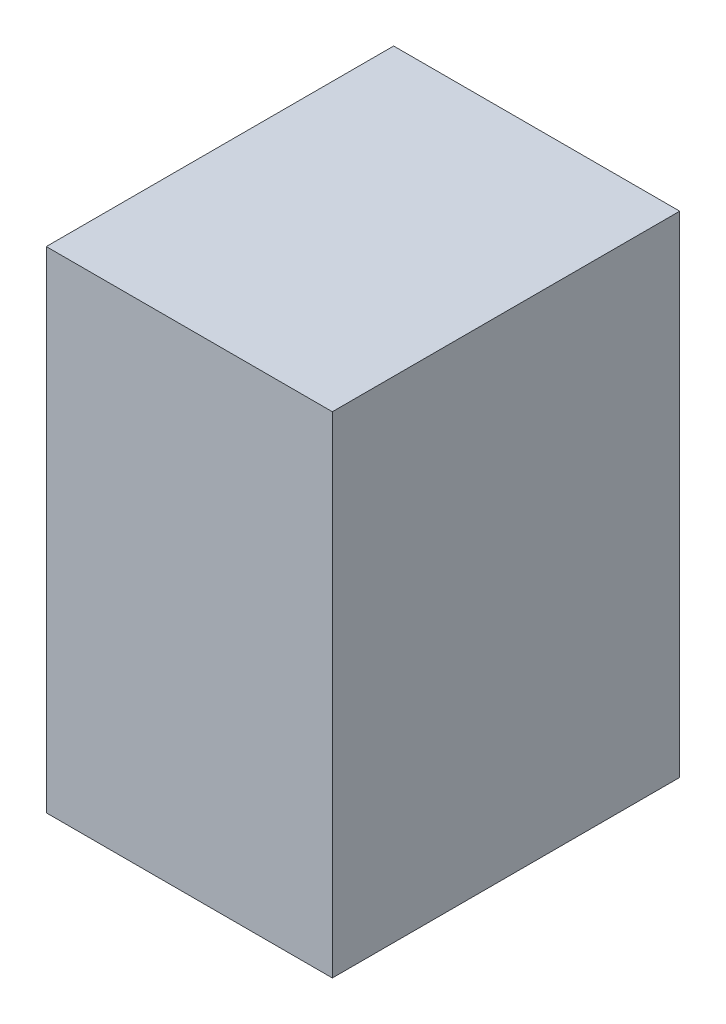
ISO-10303-21;
HEADER;
FILE_DESCRIPTION(('STEP AP214'),'2;1');
FILE_NAME('part.step','',(''),(''),'','','');
FILE_SCHEMA(('AUTOMOTIVE_DESIGN { 1 0 10303 214 1 1 1 1 }'));
ENDSEC;
DATA;
#1=APPLICATION_CONTEXT('core data for automotive mechanical design processes');
#2=APPLICATION_PROTOCOL_DEFINITION('international standard','automotive_design',2000,#1);
#3=PRODUCT_CONTEXT('',#1,'mechanical');
#4=PRODUCT('Part','Part','',(#3));
#5=PRODUCT_RELATED_PRODUCT_CATEGORY('part','',(#4));
#6=PRODUCT_DEFINITION_FORMATION('','',#4);
#7=PRODUCT_DEFINITION_CONTEXT('part definition',#1,'design');
#8=PRODUCT_DEFINITION('design','',#6,#7);
#9=PRODUCT_DEFINITION_SHAPE('','',#8);
#10=(LENGTH_UNIT() NAMED_UNIT(*) SI_UNIT(.MILLI.,.METRE.));
#11=(NAMED_UNIT(*) PLANE_ANGLE_UNIT() SI_UNIT($,.RADIAN.));
#12=(NAMED_UNIT(*) SI_UNIT($,.STERADIAN.) SOLID_ANGLE_UNIT());
#13=UNCERTAINTY_MEASURE_WITH_UNIT(LENGTH_MEASURE(1.E-05),#10,'distance_accuracy_value','');
#14=(GEOMETRIC_REPRESENTATION_CONTEXT(3) GLOBAL_UNCERTAINTY_ASSIGNED_CONTEXT((#13)) GLOBAL_UNIT_ASSIGNED_CONTEXT((#10,
#11,#12)) REPRESENTATION_CONTEXT('',''));
#15=CARTESIAN_POINT('',(0.,0.,0.));
#16=DIRECTION('',(0.,0.,1.));
#17=DIRECTION('',(1.,0.,0.));
#18=AXIS2_PLACEMENT_3D('',#15,#16,#17);
#19=CARTESIAN_POINT('',(0.,0.,0.));
#20=DIRECTION('',(0.,-1.,0.));
#21=DIRECTION('',(0.,0.,-1.));
#22=AXIS2_PLACEMENT_3D('',#19,#20,#21);
#23=PLANE('',#22);
#24=DIRECTION('',(0.,0.,-1.));
#25=VECTOR('',#24,1.);
#26=CARTESIAN_POINT('',(35.,0.,42.5));
#27=LINE('',#26,#25);
#28=CARTESIAN_POINT('',(35.,0.,42.5));
#29=VERTEX_POINT('',#28);
#30=CARTESIAN_POINT('',(35.,0.,-42.5));
#31=VERTEX_POINT('',#30);
#32=EDGE_CURVE('E136',#29,#31,#27,.T.);
#33=ORIENTED_EDGE('',*,*,#32,.F.);
#34=DIRECTION('',(1.,0.,0.));
#35=VECTOR('',#34,1.);
#36=CARTESIAN_POINT('',(-35.,0.,42.5));
#37=LINE('',#36,#35);
#38=CARTESIAN_POINT('',(-35.,0.,42.5));
#39=VERTEX_POINT('',#38);
#40=EDGE_CURVE('E84',#39,#29,#37,.T.);
#41=ORIENTED_EDGE('',*,*,#40,.F.);
#42=DIRECTION('',(0.,0.,1.));
#43=VECTOR('',#42,1.);
#44=CARTESIAN_POINT('',(-35.,0.,42.5));
#45=LINE('',#44,#43);
#46=CARTESIAN_POINT('',(-35.,0.,-42.5));
#47=VERTEX_POINT('',#46);
#48=EDGE_CURVE('E164',#47,#39,#45,.T.);
#49=ORIENTED_EDGE('',*,*,#48,.F.);
#50=DIRECTION('',(-1.,0.,0.));
#51=VECTOR('',#50,1.);
#52=CARTESIAN_POINT('',(-35.,0.,-42.5));
#53=LINE('',#52,#51);
#54=EDGE_CURVE('E140',#31,#47,#53,.T.);
#55=ORIENTED_EDGE('',*,*,#54,.F.);
#56=EDGE_LOOP('',(#33,#41,#49,#55));
#57=FACE_BOUND('',#56,.T.);
#58=DIRECTION('',(1.,0.,0.));
#59=VECTOR('',#58,1.);
#60=CARTESIAN_POINT('',(0.,0.,30.5));
#61=LINE('',#60,#59);
#62=CARTESIAN_POINT('',(-23.,0.,30.5));
#63=VERTEX_POINT('',#62);
#64=CARTESIAN_POINT('',(23.,0.,30.5));
#65=VERTEX_POINT('',#64);
#66=EDGE_CURVE('E131',#63,#65,#61,.T.);
#67=ORIENTED_EDGE('',*,*,#66,.T.);
#68=DIRECTION('',(0.,0.,-1.));
#69=VECTOR('',#68,1.);
#70=CARTESIAN_POINT('',(23.,0.,0.));
#71=LINE('',#70,#69);
#72=CARTESIAN_POINT('',(23.,0.,-30.5));
#73=VERTEX_POINT('',#72);
#74=EDGE_CURVE('E150',#65,#73,#71,.T.);
#75=ORIENTED_EDGE('',*,*,#74,.T.);
#76=DIRECTION('',(-1.,0.,0.));
#77=VECTOR('',#76,1.);
#78=CARTESIAN_POINT('',(0.,0.,-30.5));
#79=LINE('',#78,#77);
#80=CARTESIAN_POINT('',(-23.,0.,-30.5));
#81=VERTEX_POINT('',#80);
#82=EDGE_CURVE('E135',#73,#81,#79,.T.);
#83=ORIENTED_EDGE('',*,*,#82,.T.);
#84=DIRECTION('',(0.,0.,1.));
#85=VECTOR('',#84,1.);
#86=CARTESIAN_POINT('',(-23.,0.,0.));
#87=LINE('',#86,#85);
#88=EDGE_CURVE('E54',#81,#63,#87,.T.);
#89=ORIENTED_EDGE('',*,*,#88,.T.);
#90=EDGE_LOOP('',(#67,#75,#83,#89));
#91=FACE_BOUND('',#90,.T.);
#92=ADVANCED_FACE('F39',(#57,#91),#23,.T.);
#93=CARTESIAN_POINT('',(35.,120.,42.5));
#94=DIRECTION('',(-1.,0.,0.));
#95=DIRECTION('',(0.,0.,1.));
#96=AXIS2_PLACEMENT_3D('',#93,#94,#95);
#97=PLANE('',#96);
#98=ORIENTED_EDGE('',*,*,#32,.T.);
#99=DIRECTION('',(0.,-1.,0.));
#100=VECTOR('',#99,1.);
#101=CARTESIAN_POINT('',(35.,120.,-42.5));
#102=LINE('',#101,#100);
#103=CARTESIAN_POINT('',(35.,120.,-42.5));
#104=VERTEX_POINT('',#103);
#105=EDGE_CURVE('E11',#104,#31,#102,.T.);
#106=ORIENTED_EDGE('',*,*,#105,.F.);
#107=DIRECTION('',(0.,0.,-1.));
#108=VECTOR('',#107,1.);
#109=CARTESIAN_POINT('',(35.,120.,42.5));
#110=LINE('',#109,#108);
#111=CARTESIAN_POINT('',(35.,120.,42.5));
#112=VERTEX_POINT('',#111);
#113=EDGE_CURVE('E156',#112,#104,#110,.T.);
#114=ORIENTED_EDGE('',*,*,#113,.F.);
#115=DIRECTION('',(0.,-1.,0.));
#116=VECTOR('',#115,1.);
#117=CARTESIAN_POINT('',(35.,120.,42.5));
#118=LINE('',#117,#116);
#119=EDGE_CURVE('E161',#112,#29,#118,.T.);
#120=ORIENTED_EDGE('',*,*,#119,.T.);
#121=EDGE_LOOP('',(#98,#106,#114,#120));
#122=FACE_BOUND('',#121,.T.);
#123=ADVANCED_FACE('F41',(#122),#97,.F.);
#124=CARTESIAN_POINT('',(-35.,120.,-42.5));
#125=DIRECTION('',(0.,0.,1.));
#126=DIRECTION('',(1.,0.,0.));
#127=AXIS2_PLACEMENT_3D('',#124,#125,#126);
#128=PLANE('',#127);
#129=ORIENTED_EDGE('',*,*,#54,.T.);
#130=DIRECTION('',(0.,-1.,0.));
#131=VECTOR('',#130,1.);
#132=CARTESIAN_POINT('',(-35.,120.,-42.5));
#133=LINE('',#132,#131);
#134=CARTESIAN_POINT('',(-35.,120.,-42.5));
#135=VERTEX_POINT('',#134);
#136=EDGE_CURVE('E47',#135,#47,#133,.T.);
#137=ORIENTED_EDGE('',*,*,#136,.F.);
#138=DIRECTION('',(-1.,0.,0.));
#139=VECTOR('',#138,1.);
#140=CARTESIAN_POINT('',(-35.,120.,-42.5));
#141=LINE('',#140,#139);
#142=EDGE_CURVE('E91',#104,#135,#141,.T.);
#143=ORIENTED_EDGE('',*,*,#142,.F.);
#144=ORIENTED_EDGE('',*,*,#105,.T.);
#145=EDGE_LOOP('',(#129,#137,#143,#144));
#146=FACE_BOUND('',#145,.T.);
#147=ADVANCED_FACE('F190',(#146),#128,.F.);
#148=CARTESIAN_POINT('',(-35.,120.,42.5));
#149=DIRECTION('',(1.,0.,0.));
#150=DIRECTION('',(0.,0.,-1.));
#151=AXIS2_PLACEMENT_3D('',#148,#149,#150);
#152=PLANE('',#151);
#153=ORIENTED_EDGE('',*,*,#48,.T.);
#154=DIRECTION('',(0.,-1.,0.));
#155=VECTOR('',#154,1.);
#156=CARTESIAN_POINT('',(-35.,120.,42.5));
#157=LINE('',#156,#155);
#158=CARTESIAN_POINT('',(-35.,120.,42.5));
#159=VERTEX_POINT('',#158);
#160=EDGE_CURVE('E168',#159,#39,#157,.T.);
#161=ORIENTED_EDGE('',*,*,#160,.F.);
#162=DIRECTION('',(0.,0.,1.));
#163=VECTOR('',#162,1.);
#164=CARTESIAN_POINT('',(-35.,120.,42.5));
#165=LINE('',#164,#163);
#166=EDGE_CURVE('E159',#135,#159,#165,.T.);
#167=ORIENTED_EDGE('',*,*,#166,.F.);
#168=ORIENTED_EDGE('',*,*,#136,.T.);
#169=EDGE_LOOP('',(#153,#161,#167,#168));
#170=FACE_BOUND('',#169,.T.);
#171=ADVANCED_FACE('F173',(#170),#152,.F.);
#172=CARTESIAN_POINT('',(-35.,120.,42.5));
#173=DIRECTION('',(0.,0.,-1.));
#174=DIRECTION('',(-1.,0.,0.));
#175=AXIS2_PLACEMENT_3D('',#172,#173,#174);
#176=PLANE('',#175);
#177=ORIENTED_EDGE('',*,*,#40,.T.);
#178=ORIENTED_EDGE('',*,*,#119,.F.);
#179=DIRECTION('',(1.,0.,0.));
#180=VECTOR('',#179,1.);
#181=CARTESIAN_POINT('',(-35.,120.,42.5));
#182=LINE('',#181,#180);
#183=EDGE_CURVE('E63',#159,#112,#182,.T.);
#184=ORIENTED_EDGE('',*,*,#183,.F.);
#185=ORIENTED_EDGE('',*,*,#160,.T.);
#186=EDGE_LOOP('',(#177,#178,#184,#185));
#187=FACE_BOUND('',#186,.T.);
#188=ADVANCED_FACE('F181',(#187),#176,.F.);
#189=CARTESIAN_POINT('',(0.,120.,0.));
#190=DIRECTION('',(0.,-1.,0.));
#191=DIRECTION('',(0.,0.,-1.));
#192=AXIS2_PLACEMENT_3D('',#189,#190,#191);
#193=PLANE('',#192);
#194=ORIENTED_EDGE('',*,*,#113,.T.);
#195=ORIENTED_EDGE('',*,*,#142,.T.);
#196=ORIENTED_EDGE('',*,*,#166,.T.);
#197=ORIENTED_EDGE('',*,*,#183,.T.);
#198=EDGE_LOOP('',(#194,#195,#196,#197));
#199=FACE_BOUND('',#198,.T.);
#200=ADVANCED_FACE('F183',(#199),#193,.F.);
#201=CARTESIAN_POINT('',(23.,120.,42.5));
#202=DIRECTION('',(-1.,0.,0.));
#203=DIRECTION('',(0.,0.,1.));
#204=AXIS2_PLACEMENT_3D('',#201,#202,#203);
#205=PLANE('',#204);
#206=ORIENTED_EDGE('',*,*,#74,.F.);
#207=DIRECTION('',(0.,-1.,0.));
#208=VECTOR('',#207,1.);
#209=CARTESIAN_POINT('',(23.,120.,30.5));
#210=LINE('',#209,#208);
#211=CARTESIAN_POINT('',(23.,108.,30.5));
#212=VERTEX_POINT('',#211);
#213=EDGE_CURVE('E130',#212,#65,#210,.T.);
#214=ORIENTED_EDGE('',*,*,#213,.F.);
#215=DIRECTION('',(0.,0.,-1.));
#216=VECTOR('',#215,1.);
#217=CARTESIAN_POINT('',(23.,108.,0.));
#218=LINE('',#217,#216);
#219=CARTESIAN_POINT('',(23.,108.,-30.5));
#220=VERTEX_POINT('',#219);
#221=EDGE_CURVE('E118',#212,#220,#218,.T.);
#222=ORIENTED_EDGE('',*,*,#221,.T.);
#223=DIRECTION('',(0.,-1.,0.));
#224=VECTOR('',#223,1.);
#225=CARTESIAN_POINT('',(23.,120.,-30.5));
#226=LINE('',#225,#224);
#227=EDGE_CURVE('E128',#220,#73,#226,.T.);
#228=ORIENTED_EDGE('',*,*,#227,.T.);
#229=EDGE_LOOP('',(#206,#214,#222,#228));
#230=FACE_BOUND('',#229,.T.);
#231=ADVANCED_FACE('F127',(#230),#205,.T.);
#232=CARTESIAN_POINT('',(-35.,120.,-30.5));
#233=DIRECTION('',(0.,0.,1.));
#234=DIRECTION('',(1.,0.,0.));
#235=AXIS2_PLACEMENT_3D('',#232,#233,#234);
#236=PLANE('',#235);
#237=ORIENTED_EDGE('',*,*,#82,.F.);
#238=ORIENTED_EDGE('',*,*,#227,.F.);
#239=DIRECTION('',(-1.,0.,0.));
#240=VECTOR('',#239,1.);
#241=CARTESIAN_POINT('',(0.,108.,-30.5));
#242=LINE('',#241,#240);
#243=CARTESIAN_POINT('',(-23.,108.,-30.5));
#244=VERTEX_POINT('',#243);
#245=EDGE_CURVE('E114',#220,#244,#242,.T.);
#246=ORIENTED_EDGE('',*,*,#245,.T.);
#247=DIRECTION('',(0.,-1.,0.));
#248=VECTOR('',#247,1.);
#249=CARTESIAN_POINT('',(-23.,120.,-30.5));
#250=LINE('',#249,#248);
#251=EDGE_CURVE('E137',#244,#81,#250,.T.);
#252=ORIENTED_EDGE('',*,*,#251,.T.);
#253=EDGE_LOOP('',(#237,#238,#246,#252));
#254=FACE_BOUND('',#253,.T.);
#255=ADVANCED_FACE('F133',(#254),#236,.T.);
#256=CARTESIAN_POINT('',(-23.,120.,42.5));
#257=DIRECTION('',(1.,0.,0.));
#258=DIRECTION('',(0.,0.,-1.));
#259=AXIS2_PLACEMENT_3D('',#256,#257,#258);
#260=PLANE('',#259);
#261=ORIENTED_EDGE('',*,*,#88,.F.);
#262=ORIENTED_EDGE('',*,*,#251,.F.);
#263=DIRECTION('',(0.,0.,1.));
#264=VECTOR('',#263,1.);
#265=CARTESIAN_POINT('',(-23.,108.,0.));
#266=LINE('',#265,#264);
#267=CARTESIAN_POINT('',(-23.,108.,30.5));
#268=VERTEX_POINT('',#267);
#269=EDGE_CURVE('E119',#244,#268,#266,.T.);
#270=ORIENTED_EDGE('',*,*,#269,.T.);
#271=DIRECTION('',(0.,-1.,0.));
#272=VECTOR('',#271,1.);
#273=CARTESIAN_POINT('',(-23.,120.,30.5));
#274=LINE('',#273,#272);
#275=EDGE_CURVE('E142',#268,#63,#274,.T.);
#276=ORIENTED_EDGE('',*,*,#275,.T.);
#277=EDGE_LOOP('',(#261,#262,#270,#276));
#278=FACE_BOUND('',#277,.T.);
#279=ADVANCED_FACE('F203',(#278),#260,.T.);
#280=CARTESIAN_POINT('',(-35.,120.,30.5));
#281=DIRECTION('',(0.,0.,-1.));
#282=DIRECTION('',(-1.,0.,0.));
#283=AXIS2_PLACEMENT_3D('',#280,#281,#282);
#284=PLANE('',#283);
#285=ORIENTED_EDGE('',*,*,#66,.F.);
#286=ORIENTED_EDGE('',*,*,#275,.F.);
#287=DIRECTION('',(1.,0.,0.));
#288=VECTOR('',#287,1.);
#289=CARTESIAN_POINT('',(0.,108.,30.5));
#290=LINE('',#289,#288);
#291=EDGE_CURVE('E145',#268,#212,#290,.T.);
#292=ORIENTED_EDGE('',*,*,#291,.T.);
#293=ORIENTED_EDGE('',*,*,#213,.T.);
#294=EDGE_LOOP('',(#285,#286,#292,#293));
#295=FACE_BOUND('',#294,.T.);
#296=ADVANCED_FACE('F200',(#295),#284,.T.);
#297=CARTESIAN_POINT('',(0.,108.,0.));
#298=DIRECTION('',(0.,-1.,0.));
#299=DIRECTION('',(0.,0.,-1.));
#300=AXIS2_PLACEMENT_3D('',#297,#298,#299);
#301=PLANE('',#300);
#302=ORIENTED_EDGE('',*,*,#221,.F.);
#303=ORIENTED_EDGE('',*,*,#291,.F.);
#304=ORIENTED_EDGE('',*,*,#269,.F.);
#305=ORIENTED_EDGE('',*,*,#245,.F.);
#306=EDGE_LOOP('',(#302,#303,#304,#305));
#307=FACE_BOUND('',#306,.T.);
#308=ADVANCED_FACE('F116',(#307),#301,.T.);
#309=CLOSED_SHELL('',(#92,#123,#147,#171,#188,#200,#231,#255,#279,#296,#308));
#310=MANIFOLD_SOLID_BREP('B2',#309);
#311=ADVANCED_BREP_SHAPE_REPRESENTATION('',(#18,#310),#14);
#312=SHAPE_DEFINITION_REPRESENTATION(#9,#311);
ENDSEC;
END-ISO-10303-21;
